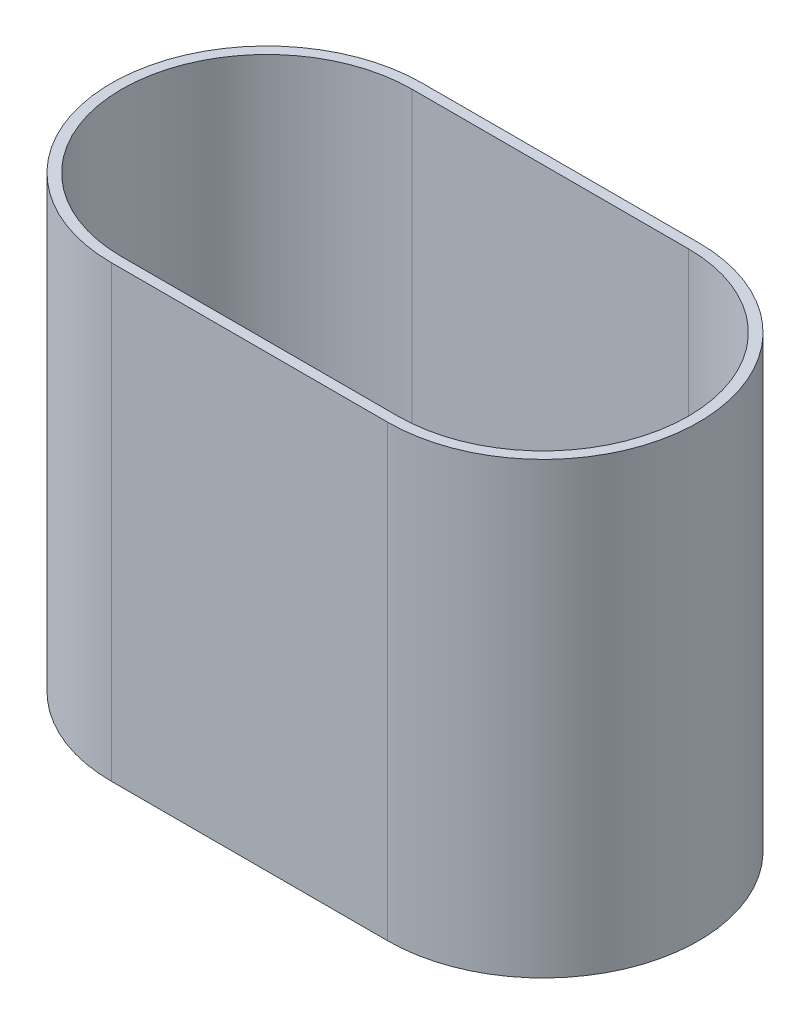
ISO-10303-21;
HEADER;
FILE_DESCRIPTION(('STEP AP214'),'2;1');
FILE_NAME('part.step','',(''),(''),'','','');
FILE_SCHEMA(('AUTOMOTIVE_DESIGN { 1 0 10303 214 1 1 1 1 }'));
ENDSEC;
DATA;
#1=APPLICATION_CONTEXT('core data for automotive mechanical design processes');
#2=APPLICATION_PROTOCOL_DEFINITION('international standard','automotive_design',2000,#1);
#3=PRODUCT_CONTEXT('',#1,'mechanical');
#4=PRODUCT('Part','Part','',(#3));
#5=PRODUCT_RELATED_PRODUCT_CATEGORY('part','',(#4));
#6=PRODUCT_DEFINITION_FORMATION('','',#4);
#7=PRODUCT_DEFINITION_CONTEXT('part definition',#1,'design');
#8=PRODUCT_DEFINITION('design','',#6,#7);
#9=PRODUCT_DEFINITION_SHAPE('','',#8);
#10=(LENGTH_UNIT() NAMED_UNIT(*) SI_UNIT(.MILLI.,.METRE.));
#11=(NAMED_UNIT(*) PLANE_ANGLE_UNIT() SI_UNIT($,.RADIAN.));
#12=(NAMED_UNIT(*) SI_UNIT($,.STERADIAN.) SOLID_ANGLE_UNIT());
#13=UNCERTAINTY_MEASURE_WITH_UNIT(LENGTH_MEASURE(1.E-05),#10,'distance_accuracy_value','');
#14=(GEOMETRIC_REPRESENTATION_CONTEXT(3) GLOBAL_UNCERTAINTY_ASSIGNED_CONTEXT((#13)) GLOBAL_UNIT_ASSIGNED_CONTEXT((#10,
#11,#12)) REPRESENTATION_CONTEXT('',''));
#15=CARTESIAN_POINT('',(0.,0.,0.));
#16=DIRECTION('',(0.,0.,1.));
#17=DIRECTION('',(1.,0.,0.));
#18=AXIS2_PLACEMENT_3D('',#15,#16,#17);
#19=CARTESIAN_POINT('',(-40.,130.,0.));
#20=DIRECTION('',(0.,-1.,0.));
#21=DIRECTION('',(0.,0.,-1.));
#22=AXIS2_PLACEMENT_3D('',#19,#20,#21);
#23=PLANE('',#22);
#24=CARTESIAN_POINT('',(-40.,130.,0.));
#25=DIRECTION('',(0.,1.,0.));
#26=DIRECTION('',(0.,0.,-1.));
#27=AXIS2_PLACEMENT_3D('',#24,#25,#26);
#28=CIRCLE('',#27,45.);
#29=CARTESIAN_POINT('',(-40.,130.,-45.));
#30=VERTEX_POINT('',#29);
#31=CARTESIAN_POINT('',(-40.,130.,44.9999999999999));
#32=VERTEX_POINT('',#31);
#33=EDGE_CURVE('E130',#30,#32,#28,.T.);
#34=ORIENTED_EDGE('',*,*,#33,.T.);
#35=DIRECTION('',(1.,0.,0.));
#36=VECTOR('',#35,1.);
#37=CARTESIAN_POINT('',(-40.,130.,44.9999999999999));
#38=LINE('',#37,#36);
#39=CARTESIAN_POINT('',(40.,130.,45.));
#40=VERTEX_POINT('',#39);
#41=EDGE_CURVE('E133',#32,#40,#38,.T.);
#42=ORIENTED_EDGE('',*,*,#41,.T.);
#43=CARTESIAN_POINT('',(40.,130.,0.));
#44=DIRECTION('',(0.,1.,0.));
#45=DIRECTION('',(0.,0.,1.));
#46=AXIS2_PLACEMENT_3D('',#43,#44,#45);
#47=CIRCLE('',#46,45.);
#48=CARTESIAN_POINT('',(40.,130.,-45.));
#49=VERTEX_POINT('',#48);
#50=EDGE_CURVE('E136',#40,#49,#47,.T.);
#51=ORIENTED_EDGE('',*,*,#50,.T.);
#52=DIRECTION('',(-1.,0.,0.));
#53=VECTOR('',#52,1.);
#54=CARTESIAN_POINT('',(-40.,130.,-45.));
#55=LINE('',#54,#53);
#56=EDGE_CURVE('E138',#49,#30,#55,.T.);
#57=ORIENTED_EDGE('',*,*,#56,.T.);
#58=EDGE_LOOP('',(#34,#42,#51,#57));
#59=FACE_BOUND('',#58,.T.);
#60=CARTESIAN_POINT('',(-40.,130.,0.));
#61=DIRECTION('',(0.,-1.,0.));
#62=DIRECTION('',(0.,0.,-1.));
#63=AXIS2_PLACEMENT_3D('',#60,#61,#62);
#64=CIRCLE('',#63,42.);
#65=CARTESIAN_POINT('',(-40.,130.,-42.));
#66=VERTEX_POINT('',#65);
#67=CARTESIAN_POINT('',(-40.,130.,41.9999999999999));
#68=VERTEX_POINT('',#67);
#69=EDGE_CURVE('E118',#66,#68,#64,.F.);
#70=ORIENTED_EDGE('',*,*,#69,.F.);
#71=DIRECTION('',(-1.,0.,0.));
#72=VECTOR('',#71,1.);
#73=CARTESIAN_POINT('',(-40.,130.,-42.));
#74=LINE('',#73,#72);
#75=CARTESIAN_POINT('',(40.,130.,-42.));
#76=VERTEX_POINT('',#75);
#77=EDGE_CURVE('E103',#76,#66,#74,.T.);
#78=ORIENTED_EDGE('',*,*,#77,.F.);
#79=CARTESIAN_POINT('',(40.,130.,0.));
#80=DIRECTION('',(0.,-1.,0.));
#81=DIRECTION('',(0.,0.,-1.));
#82=AXIS2_PLACEMENT_3D('',#79,#80,#81);
#83=CIRCLE('',#82,42.);
#84=CARTESIAN_POINT('',(40.,130.,42.));
#85=VERTEX_POINT('',#84);
#86=EDGE_CURVE('E127',#85,#76,#83,.F.);
#87=ORIENTED_EDGE('',*,*,#86,.F.);
#88=DIRECTION('',(1.,0.,0.));
#89=VECTOR('',#88,1.);
#90=CARTESIAN_POINT('',(-40.,130.,41.9999999999999));
#91=LINE('',#90,#89);
#92=EDGE_CURVE('E120',#68,#85,#91,.T.);
#93=ORIENTED_EDGE('',*,*,#92,.F.);
#94=EDGE_LOOP('',(#70,#78,#87,#93));
#95=FACE_BOUND('',#94,.T.);
#96=ADVANCED_FACE('F33',(#59,#95),#23,.F.);
#97=CARTESIAN_POINT('',(-40.,0.,0.));
#98=DIRECTION('',(0.,-1.,0.));
#99=DIRECTION('',(0.,0.,-1.));
#100=AXIS2_PLACEMENT_3D('',#97,#98,#99);
#101=PLANE('',#100);
#102=CARTESIAN_POINT('',(-40.,0.,0.));
#103=DIRECTION('',(0.,1.,0.));
#104=DIRECTION('',(0.,0.,-1.));
#105=AXIS2_PLACEMENT_3D('',#102,#103,#104);
#106=CIRCLE('',#105,45.);
#107=CARTESIAN_POINT('',(-40.,0.,-45.));
#108=VERTEX_POINT('',#107);
#109=CARTESIAN_POINT('',(-40.,0.,44.9999999999999));
#110=VERTEX_POINT('',#109);
#111=EDGE_CURVE('E141',#108,#110,#106,.T.);
#112=ORIENTED_EDGE('',*,*,#111,.F.);
#113=DIRECTION('',(-1.,0.,0.));
#114=VECTOR('',#113,1.);
#115=CARTESIAN_POINT('',(-40.,0.,-45.));
#116=LINE('',#115,#114);
#117=CARTESIAN_POINT('',(40.,0.,-45.));
#118=VERTEX_POINT('',#117);
#119=EDGE_CURVE('E134',#118,#108,#116,.T.);
#120=ORIENTED_EDGE('',*,*,#119,.F.);
#121=CARTESIAN_POINT('',(40.,0.,0.));
#122=DIRECTION('',(0.,1.,0.));
#123=DIRECTION('',(0.,0.,1.));
#124=AXIS2_PLACEMENT_3D('',#121,#122,#123);
#125=CIRCLE('',#124,45.);
#126=CARTESIAN_POINT('',(40.,0.,45.));
#127=VERTEX_POINT('',#126);
#128=EDGE_CURVE('E146',#127,#118,#125,.T.);
#129=ORIENTED_EDGE('',*,*,#128,.F.);
#130=DIRECTION('',(1.,0.,0.));
#131=VECTOR('',#130,1.);
#132=CARTESIAN_POINT('',(-40.,0.,44.9999999999999));
#133=LINE('',#132,#131);
#134=EDGE_CURVE('E144',#110,#127,#133,.T.);
#135=ORIENTED_EDGE('',*,*,#134,.F.);
#136=EDGE_LOOP('',(#112,#120,#129,#135));
#137=FACE_BOUND('',#136,.T.);
#138=DIRECTION('',(-1.,0.,0.));
#139=VECTOR('',#138,1.);
#140=CARTESIAN_POINT('',(-40.,0.,-42.));
#141=LINE('',#140,#139);
#142=CARTESIAN_POINT('',(40.,0.,-42.));
#143=VERTEX_POINT('',#142);
#144=CARTESIAN_POINT('',(-40.,0.,-42.));
#145=VERTEX_POINT('',#144);
#146=EDGE_CURVE('E101',#143,#145,#141,.T.);
#147=ORIENTED_EDGE('',*,*,#146,.T.);
#148=CARTESIAN_POINT('',(-40.,0.,0.));
#149=DIRECTION('',(0.,-1.,0.));
#150=DIRECTION('',(0.,0.,-1.));
#151=AXIS2_PLACEMENT_3D('',#148,#149,#150);
#152=CIRCLE('',#151,42.);
#153=CARTESIAN_POINT('',(-40.,0.,41.9999999999999));
#154=VERTEX_POINT('',#153);
#155=EDGE_CURVE('E109',#145,#154,#152,.F.);
#156=ORIENTED_EDGE('',*,*,#155,.T.);
#157=DIRECTION('',(1.,0.,0.));
#158=VECTOR('',#157,1.);
#159=CARTESIAN_POINT('',(-40.,0.,41.9999999999999));
#160=LINE('',#159,#158);
#161=CARTESIAN_POINT('',(40.,0.,42.));
#162=VERTEX_POINT('',#161);
#163=EDGE_CURVE('E115',#154,#162,#160,.T.);
#164=ORIENTED_EDGE('',*,*,#163,.T.);
#165=CARTESIAN_POINT('',(40.,0.,0.));
#166=DIRECTION('',(0.,-1.,0.));
#167=DIRECTION('',(0.,0.,-1.));
#168=AXIS2_PLACEMENT_3D('',#165,#166,#167);
#169=CIRCLE('',#168,42.);
#170=EDGE_CURVE('E55',#162,#143,#169,.F.);
#171=ORIENTED_EDGE('',*,*,#170,.T.);
#172=EDGE_LOOP('',(#147,#156,#164,#171));
#173=FACE_BOUND('',#172,.T.);
#174=ADVANCED_FACE('F117',(#137,#173),#101,.T.);
#175=CARTESIAN_POINT('',(-40.,130.,0.));
#176=DIRECTION('',(0.,-1.,0.));
#177=DIRECTION('',(0.,0.,-1.));
#178=AXIS2_PLACEMENT_3D('',#175,#176,#177);
#179=CYLINDRICAL_SURFACE('',#178,45.);
#180=ORIENTED_EDGE('',*,*,#111,.T.);
#181=DIRECTION('',(0.,-1.,0.));
#182=VECTOR('',#181,1.);
#183=CARTESIAN_POINT('',(-40.,130.,44.9999999999999));
#184=LINE('',#183,#182);
#185=EDGE_CURVE('E11',#32,#110,#184,.T.);
#186=ORIENTED_EDGE('',*,*,#185,.F.);
#187=ORIENTED_EDGE('',*,*,#33,.F.);
#188=DIRECTION('',(0.,-1.,0.));
#189=VECTOR('',#188,1.);
#190=CARTESIAN_POINT('',(-40.,130.,-45.));
#191=LINE('',#190,#189);
#192=EDGE_CURVE('E140',#30,#108,#191,.T.);
#193=ORIENTED_EDGE('',*,*,#192,.T.);
#194=EDGE_LOOP('',(#180,#186,#187,#193));
#195=FACE_BOUND('',#194,.T.);
#196=ADVANCED_FACE('F35',(#195),#179,.T.);
#197=CARTESIAN_POINT('',(-40.,130.,44.9999999999999));
#198=DIRECTION('',(0.,0.,-1.));
#199=DIRECTION('',(-1.,0.,0.));
#200=AXIS2_PLACEMENT_3D('',#197,#198,#199);
#201=PLANE('',#200);
#202=ORIENTED_EDGE('',*,*,#134,.T.);
#203=DIRECTION('',(0.,-1.,0.));
#204=VECTOR('',#203,1.);
#205=CARTESIAN_POINT('',(40.,130.,45.));
#206=LINE('',#205,#204);
#207=EDGE_CURVE('E41',#40,#127,#206,.T.);
#208=ORIENTED_EDGE('',*,*,#207,.F.);
#209=ORIENTED_EDGE('',*,*,#41,.F.);
#210=ORIENTED_EDGE('',*,*,#185,.T.);
#211=EDGE_LOOP('',(#202,#208,#209,#210));
#212=FACE_BOUND('',#211,.T.);
#213=ADVANCED_FACE('F173',(#212),#201,.F.);
#214=CARTESIAN_POINT('',(40.,130.,0.));
#215=DIRECTION('',(0.,-1.,0.));
#216=DIRECTION('',(0.,0.,-1.));
#217=AXIS2_PLACEMENT_3D('',#214,#215,#216);
#218=CYLINDRICAL_SURFACE('',#217,45.);
#219=ORIENTED_EDGE('',*,*,#128,.T.);
#220=DIRECTION('',(0.,-1.,0.));
#221=VECTOR('',#220,1.);
#222=CARTESIAN_POINT('',(40.,130.,-45.));
#223=LINE('',#222,#221);
#224=EDGE_CURVE('E151',#49,#118,#223,.T.);
#225=ORIENTED_EDGE('',*,*,#224,.F.);
#226=ORIENTED_EDGE('',*,*,#50,.F.);
#227=ORIENTED_EDGE('',*,*,#207,.T.);
#228=EDGE_LOOP('',(#219,#225,#226,#227));
#229=FACE_BOUND('',#228,.T.);
#230=ADVANCED_FACE('F158',(#229),#218,.T.);
#231=CARTESIAN_POINT('',(-40.,130.,-45.));
#232=DIRECTION('',(0.,0.,1.));
#233=DIRECTION('',(1.,0.,0.));
#234=AXIS2_PLACEMENT_3D('',#231,#232,#233);
#235=PLANE('',#234);
#236=ORIENTED_EDGE('',*,*,#119,.T.);
#237=ORIENTED_EDGE('',*,*,#192,.F.);
#238=ORIENTED_EDGE('',*,*,#56,.F.);
#239=ORIENTED_EDGE('',*,*,#224,.T.);
#240=EDGE_LOOP('',(#236,#237,#238,#239));
#241=FACE_BOUND('',#240,.T.);
#242=ADVANCED_FACE('F166',(#241),#235,.F.);
#243=CARTESIAN_POINT('',(-40.,130.,0.));
#244=DIRECTION('',(0.,-1.,0.));
#245=DIRECTION('',(0.,0.,-1.));
#246=AXIS2_PLACEMENT_3D('',#243,#244,#245);
#247=CYLINDRICAL_SURFACE('',#246,42.);
#248=ORIENTED_EDGE('',*,*,#155,.F.);
#249=DIRECTION('',(0.,-1.,0.));
#250=VECTOR('',#249,1.);
#251=CARTESIAN_POINT('',(-40.,130.,-42.));
#252=LINE('',#251,#250);
#253=EDGE_CURVE('E97',#66,#145,#252,.T.);
#254=ORIENTED_EDGE('',*,*,#253,.F.);
#255=ORIENTED_EDGE('',*,*,#69,.T.);
#256=DIRECTION('',(0.,1.,0.));
#257=VECTOR('',#256,1.);
#258=CARTESIAN_POINT('',(-40.,130.,41.9999999999999));
#259=LINE('',#258,#257);
#260=EDGE_CURVE('E112',#68,#154,#259,.F.);
#261=ORIENTED_EDGE('',*,*,#260,.T.);
#262=EDGE_LOOP('',(#248,#254,#255,#261));
#263=FACE_BOUND('',#262,.T.);
#264=ADVANCED_FACE('F110',(#263),#247,.F.);
#265=CARTESIAN_POINT('',(-40.,130.,41.9999999999999));
#266=DIRECTION('',(0.,0.,-1.));
#267=DIRECTION('',(-1.,0.,0.));
#268=AXIS2_PLACEMENT_3D('',#265,#266,#267);
#269=PLANE('',#268);
#270=ORIENTED_EDGE('',*,*,#163,.F.);
#271=ORIENTED_EDGE('',*,*,#260,.F.);
#272=ORIENTED_EDGE('',*,*,#92,.T.);
#273=DIRECTION('',(0.,-1.,0.));
#274=VECTOR('',#273,1.);
#275=CARTESIAN_POINT('',(40.,130.,42.));
#276=LINE('',#275,#274);
#277=EDGE_CURVE('E256',#85,#162,#276,.T.);
#278=ORIENTED_EDGE('',*,*,#277,.T.);
#279=EDGE_LOOP('',(#270,#271,#272,#278));
#280=FACE_BOUND('',#279,.T.);
#281=ADVANCED_FACE('F193',(#280),#269,.T.);
#282=CARTESIAN_POINT('',(40.,130.,0.));
#283=DIRECTION('',(0.,-1.,0.));
#284=DIRECTION('',(0.,0.,-1.));
#285=AXIS2_PLACEMENT_3D('',#282,#283,#284);
#286=CYLINDRICAL_SURFACE('',#285,42.);
#287=ORIENTED_EDGE('',*,*,#170,.F.);
#288=ORIENTED_EDGE('',*,*,#277,.F.);
#289=ORIENTED_EDGE('',*,*,#86,.T.);
#290=DIRECTION('',(0.,1.,0.));
#291=VECTOR('',#290,1.);
#292=CARTESIAN_POINT('',(40.,130.,-42.));
#293=LINE('',#292,#291);
#294=EDGE_CURVE('E48',#76,#143,#293,.F.);
#295=ORIENTED_EDGE('',*,*,#294,.T.);
#296=EDGE_LOOP('',(#287,#288,#289,#295));
#297=FACE_BOUND('',#296,.T.);
#298=ADVANCED_FACE('F198',(#297),#286,.F.);
#299=CARTESIAN_POINT('',(-40.,130.,-42.));
#300=DIRECTION('',(0.,0.,1.));
#301=DIRECTION('',(1.,0.,0.));
#302=AXIS2_PLACEMENT_3D('',#299,#300,#301);
#303=PLANE('',#302);
#304=ORIENTED_EDGE('',*,*,#146,.F.);
#305=ORIENTED_EDGE('',*,*,#294,.F.);
#306=ORIENTED_EDGE('',*,*,#77,.T.);
#307=ORIENTED_EDGE('',*,*,#253,.T.);
#308=EDGE_LOOP('',(#304,#305,#306,#307));
#309=FACE_BOUND('',#308,.T.);
#310=ADVANCED_FACE('F99',(#309),#303,.T.);
#311=CLOSED_SHELL('',(#96,#174,#196,#213,#230,#242,#264,#281,#298,#310));
#312=MANIFOLD_SOLID_BREP('B2',#311);
#313=ADVANCED_BREP_SHAPE_REPRESENTATION('',(#18,#312),#14);
#314=SHAPE_DEFINITION_REPRESENTATION(#9,#313);
ENDSEC;
END-ISO-10303-21;
